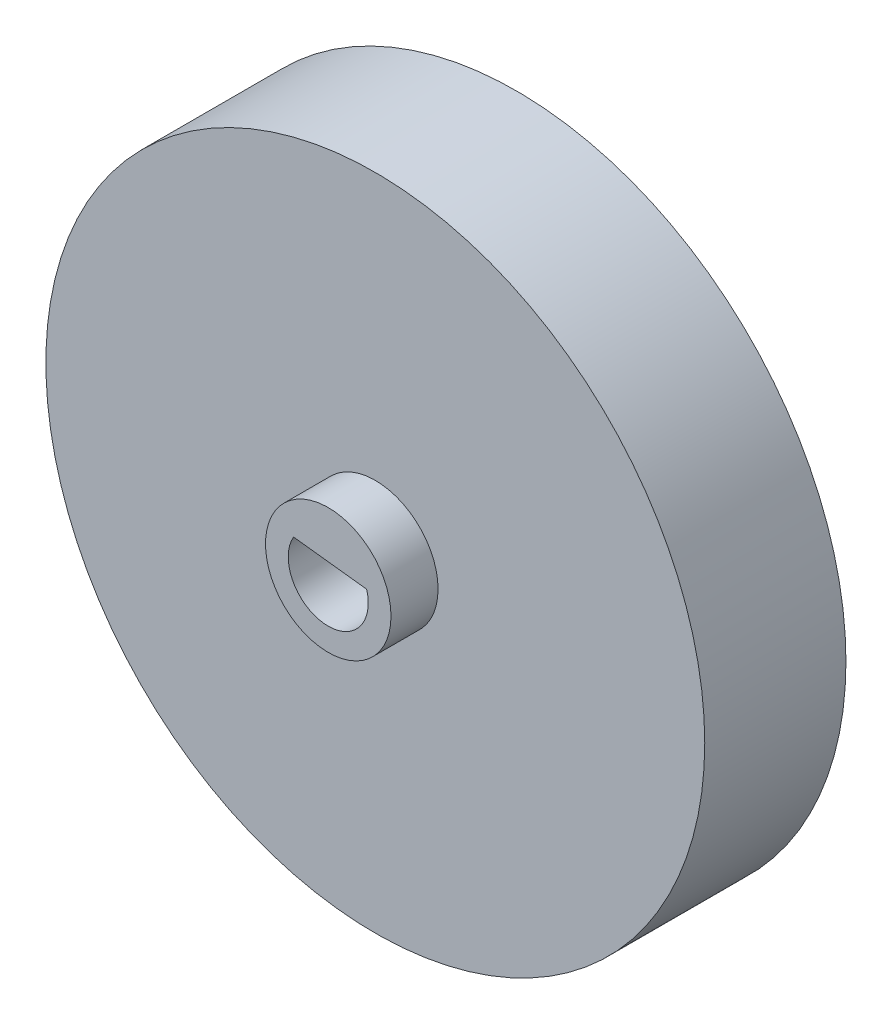
ISO-10303-21;
HEADER;
FILE_DESCRIPTION(('STEP AP214'),'2;1');
FILE_NAME('part.step','',(''),(''),'','','');
FILE_SCHEMA(('AUTOMOTIVE_DESIGN { 1 0 10303 214 1 1 1 1 }'));
ENDSEC;
DATA;
#1=APPLICATION_CONTEXT('core data for automotive mechanical design processes');
#2=APPLICATION_PROTOCOL_DEFINITION('international standard','automotive_design',2000,#1);
#3=PRODUCT_CONTEXT('',#1,'mechanical');
#4=PRODUCT('Part','Part','',(#3));
#5=PRODUCT_RELATED_PRODUCT_CATEGORY('part','',(#4));
#6=PRODUCT_DEFINITION_FORMATION('','',#4);
#7=PRODUCT_DEFINITION_CONTEXT('part definition',#1,'design');
#8=PRODUCT_DEFINITION('design','',#6,#7);
#9=PRODUCT_DEFINITION_SHAPE('','',#8);
#10=(LENGTH_UNIT() NAMED_UNIT(*) SI_UNIT(.MILLI.,.METRE.));
#11=(NAMED_UNIT(*) PLANE_ANGLE_UNIT() SI_UNIT($,.RADIAN.));
#12=(NAMED_UNIT(*) SI_UNIT($,.STERADIAN.) SOLID_ANGLE_UNIT());
#13=UNCERTAINTY_MEASURE_WITH_UNIT(LENGTH_MEASURE(1.E-05),#10,'distance_accuracy_value','');
#14=(GEOMETRIC_REPRESENTATION_CONTEXT(3) GLOBAL_UNCERTAINTY_ASSIGNED_CONTEXT((#13)) GLOBAL_UNIT_ASSIGNED_CONTEXT((#10,
#11,#12)) REPRESENTATION_CONTEXT('',''));
#15=CARTESIAN_POINT('',(0.,0.,0.));
#16=DIRECTION('',(0.,0.,1.));
#17=DIRECTION('',(1.,0.,0.));
#18=AXIS2_PLACEMENT_3D('',#15,#16,#17);
#19=CARTESIAN_POINT('',(0.,0.,24.));
#20=DIRECTION('',(0.,0.,1.));
#21=DIRECTION('',(1.,0.,0.));
#22=AXIS2_PLACEMENT_3D('',#19,#20,#21);
#23=PLANE('',#22);
#24=CARTESIAN_POINT('',(0.,0.,24.));
#25=DIRECTION('',(0.,0.,1.));
#26=DIRECTION('',(1.,0.,0.));
#27=AXIS2_PLACEMENT_3D('',#24,#25,#26);
#28=CIRCLE('',#27,8.);
#29=CARTESIAN_POINT('',(8.,0.,24.));
#30=VERTEX_POINT('',#29);
#31=EDGE_CURVE('E11',#30,#30,#28,.T.);
#32=ORIENTED_EDGE('',*,*,#31,.T.);
#33=EDGE_LOOP('',(#32));
#34=FACE_BOUND('',#33,.T.);
#35=DIRECTION('',(-0.993068456954926,0.117537397457838,0.));
#36=VECTOR('',#35,1.);
#37=CARTESIAN_POINT('',(4.89403723026289,1.43471237145316,24.));
#38=LINE('',#37,#36);
#39=CARTESIAN_POINT('',(4.89403723026289,1.43471237145316,24.));
#40=VERTEX_POINT('',#39);
#41=CARTESIAN_POINT('',(-4.42388764043154,2.53756145636654,24.));
#42=VERTEX_POINT('',#41);
#43=EDGE_CURVE('E83',#40,#42,#38,.T.);
#44=ORIENTED_EDGE('',*,*,#43,.F.);
#45=CARTESIAN_POINT('',(0.,0.,24.));
#46=DIRECTION('',(0.,0.,1.));
#47=DIRECTION('',(1.,0.,0.));
#48=AXIS2_PLACEMENT_3D('',#45,#46,#47);
#49=CIRCLE('',#48,5.1);
#50=EDGE_CURVE('E70',#42,#40,#49,.T.);
#51=ORIENTED_EDGE('',*,*,#50,.F.);
#52=EDGE_LOOP('',(#44,#51));
#53=FACE_BOUND('',#52,.T.);
#54=ADVANCED_FACE('F39',(#34,#53),#23,.T.);
#55=CARTESIAN_POINT('',(0.,0.,0.));
#56=DIRECTION('',(0.,0.,1.));
#57=DIRECTION('',(1.,0.,0.));
#58=AXIS2_PLACEMENT_3D('',#55,#56,#57);
#59=PLANE('',#58);
#60=CARTESIAN_POINT('',(0.,0.,0.));
#61=DIRECTION('',(0.,0.,1.));
#62=DIRECTION('',(1.,0.,0.));
#63=AXIS2_PLACEMENT_3D('',#60,#61,#62);
#64=CIRCLE('',#63,5.1);
#65=CARTESIAN_POINT('',(-4.42388764043154,2.53756145636654,0.));
#66=VERTEX_POINT('',#65);
#67=CARTESIAN_POINT('',(4.89403723026289,1.43471237145316,0.));
#68=VERTEX_POINT('',#67);
#69=EDGE_CURVE('E60',#66,#68,#64,.T.);
#70=ORIENTED_EDGE('',*,*,#69,.T.);
#71=DIRECTION('',(-0.993068456954926,0.117537397457838,0.));
#72=VECTOR('',#71,1.);
#73=CARTESIAN_POINT('',(4.89403723026289,1.43471237145316,0.));
#74=LINE('',#73,#72);
#75=EDGE_CURVE('E66',#68,#66,#74,.T.);
#76=ORIENTED_EDGE('',*,*,#75,.T.);
#77=EDGE_LOOP('',(#70,#76));
#78=FACE_BOUND('',#77,.T.);
#79=CARTESIAN_POINT('',(0.,0.,0.));
#80=DIRECTION('',(0.,0.,1.));
#81=DIRECTION('',(1.,0.,0.));
#82=AXIS2_PLACEMENT_3D('',#79,#80,#81);
#83=CIRCLE('',#82,42.);
#84=CARTESIAN_POINT('',(42.,0.,0.));
#85=VERTEX_POINT('',#84);
#86=EDGE_CURVE('E80',#85,#85,#83,.T.);
#87=ORIENTED_EDGE('',*,*,#86,.F.);
#88=EDGE_LOOP('',(#87));
#89=FACE_BOUND('',#88,.T.);
#90=ADVANCED_FACE('F75',(#78,#89),#59,.F.);
#91=CARTESIAN_POINT('',(0.,0.,24.));
#92=DIRECTION('',(0.,0.,-1.));
#93=DIRECTION('',(-1.,0.,0.));
#94=AXIS2_PLACEMENT_3D('',#91,#92,#93);
#95=CYLINDRICAL_SURFACE('',#94,8.);
#96=CARTESIAN_POINT('',(0.,0.,18.));
#97=DIRECTION('',(0.,0.,1.));
#98=DIRECTION('',(1.,0.,0.));
#99=AXIS2_PLACEMENT_3D('',#96,#97,#98);
#100=CIRCLE('',#99,8.);
#101=CARTESIAN_POINT('',(8.,0.,18.));
#102=VERTEX_POINT('',#101);
#103=EDGE_CURVE('E88',#102,#102,#100,.T.);
#104=ORIENTED_EDGE('',*,*,#103,.T.);
#105=EDGE_LOOP('',(#104));
#106=FACE_BOUND('',#105,.T.);
#107=ORIENTED_EDGE('',*,*,#31,.F.);
#108=EDGE_LOOP('',(#107));
#109=FACE_BOUND('',#108,.T.);
#110=ADVANCED_FACE('F41',(#106,#109),#95,.T.);
#111=CARTESIAN_POINT('',(0.,0.,24.));
#112=DIRECTION('',(0.,0.,-1.));
#113=DIRECTION('',(-1.,0.,0.));
#114=AXIS2_PLACEMENT_3D('',#111,#112,#113);
#115=CYLINDRICAL_SURFACE('',#114,5.1);
#116=ORIENTED_EDGE('',*,*,#69,.F.);
#117=DIRECTION('',(0.,0.,-1.));
#118=VECTOR('',#117,1.);
#119=CARTESIAN_POINT('',(-4.42388764043154,2.53756145636654,24.));
#120=LINE('',#119,#118);
#121=EDGE_CURVE('E68',#42,#66,#120,.T.);
#122=ORIENTED_EDGE('',*,*,#121,.F.);
#123=ORIENTED_EDGE('',*,*,#50,.T.);
#124=DIRECTION('',(0.,0.,-1.));
#125=VECTOR('',#124,1.);
#126=CARTESIAN_POINT('',(4.89403723026289,1.43471237145316,24.));
#127=LINE('',#126,#125);
#128=EDGE_CURVE('E47',#40,#68,#127,.T.);
#129=ORIENTED_EDGE('',*,*,#128,.T.);
#130=EDGE_LOOP('',(#116,#122,#123,#129));
#131=FACE_BOUND('',#130,.T.);
#132=ADVANCED_FACE('F72',(#131),#115,.F.);
#133=CARTESIAN_POINT('',(4.89403723026289,1.43471237145316,24.));
#134=DIRECTION('',(-0.117537397457838,-0.993068456954926,0.));
#135=DIRECTION('',(0.993068456954926,-0.117537397457838,0.));
#136=AXIS2_PLACEMENT_3D('',#133,#134,#135);
#137=PLANE('',#136);
#138=ORIENTED_EDGE('',*,*,#75,.F.);
#139=ORIENTED_EDGE('',*,*,#128,.F.);
#140=ORIENTED_EDGE('',*,*,#43,.T.);
#141=ORIENTED_EDGE('',*,*,#121,.T.);
#142=EDGE_LOOP('',(#138,#139,#140,#141));
#143=FACE_BOUND('',#142,.T.);
#144=ADVANCED_FACE('F67',(#143),#137,.T.);
#145=CARTESIAN_POINT('',(0.,0.,18.));
#146=DIRECTION('',(0.,0.,1.));
#147=DIRECTION('',(1.,0.,0.));
#148=AXIS2_PLACEMENT_3D('',#145,#146,#147);
#149=PLANE('',#148);
#150=CARTESIAN_POINT('',(0.,0.,18.));
#151=DIRECTION('',(0.,0.,1.));
#152=DIRECTION('',(1.,0.,0.));
#153=AXIS2_PLACEMENT_3D('',#150,#151,#152);
#154=CIRCLE('',#153,42.);
#155=CARTESIAN_POINT('',(42.,0.,18.));
#156=VERTEX_POINT('',#155);
#157=EDGE_CURVE('E77',#156,#156,#154,.T.);
#158=ORIENTED_EDGE('',*,*,#157,.T.);
#159=EDGE_LOOP('',(#158));
#160=FACE_BOUND('',#159,.T.);
#161=ORIENTED_EDGE('',*,*,#103,.F.);
#162=EDGE_LOOP('',(#161));
#163=FACE_BOUND('',#162,.T.);
#164=ADVANCED_FACE('F95',(#160,#163),#149,.T.);
#165=CARTESIAN_POINT('',(0.,0.,18.));
#166=DIRECTION('',(0.,0.,-1.));
#167=DIRECTION('',(-1.,0.,0.));
#168=AXIS2_PLACEMENT_3D('',#165,#166,#167);
#169=CYLINDRICAL_SURFACE('',#168,42.);
#170=ORIENTED_EDGE('',*,*,#157,.F.);
#171=EDGE_LOOP('',(#170));
#172=FACE_BOUND('',#171,.T.);
#173=ORIENTED_EDGE('',*,*,#86,.T.);
#174=EDGE_LOOP('',(#173));
#175=FACE_BOUND('',#174,.T.);
#176=ADVANCED_FACE('F97',(#172,#175),#169,.T.);
#177=CLOSED_SHELL('',(#54,#90,#110,#132,#144,#164,#176));
#178=MANIFOLD_SOLID_BREP('B2',#177);
#179=ADVANCED_BREP_SHAPE_REPRESENTATION('',(#18,#178),#14);
#180=SHAPE_DEFINITION_REPRESENTATION(#9,#179);
ENDSEC;
END-ISO-10303-21;
